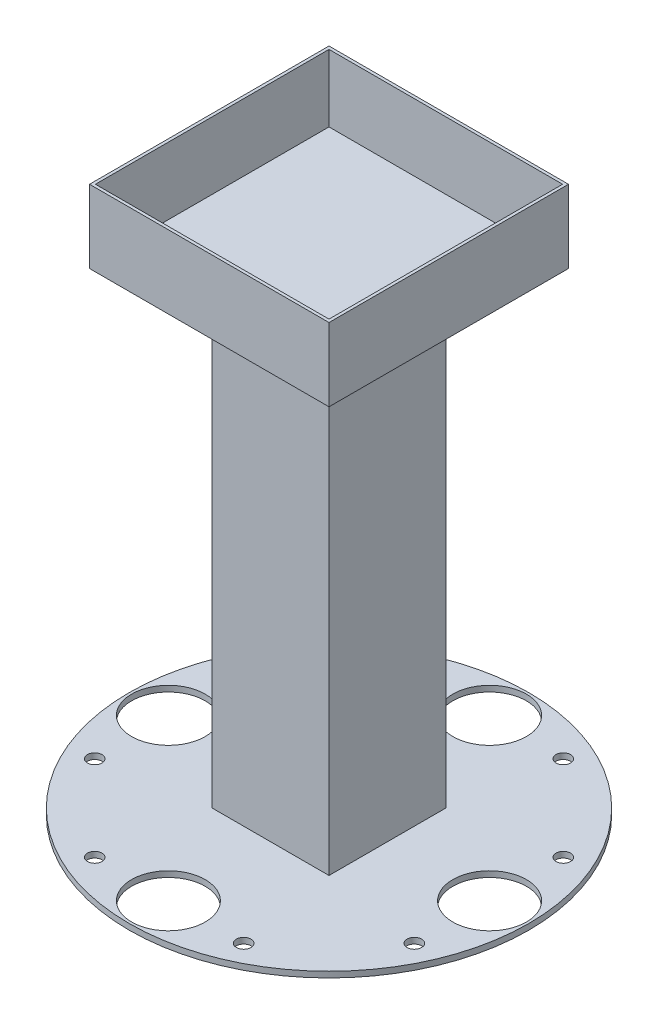
ISO-10303-21;
HEADER;
FILE_DESCRIPTION(('STEP AP214'),'2;1');
FILE_NAME('part.step','',(''),(''),'','','');
FILE_SCHEMA(('AUTOMOTIVE_DESIGN { 1 0 10303 214 1 1 1 1 }'));
ENDSEC;
DATA;
#1=APPLICATION_CONTEXT('core data for automotive mechanical design processes');
#2=APPLICATION_PROTOCOL_DEFINITION('international standard','automotive_design',2000,#1);
#3=PRODUCT_CONTEXT('',#1,'mechanical');
#4=PRODUCT('Part','Part','',(#3));
#5=PRODUCT_RELATED_PRODUCT_CATEGORY('part','',(#4));
#6=PRODUCT_DEFINITION_FORMATION('','',#4);
#7=PRODUCT_DEFINITION_CONTEXT('part definition',#1,'design');
#8=PRODUCT_DEFINITION('design','',#6,#7);
#9=PRODUCT_DEFINITION_SHAPE('','',#8);
#10=(LENGTH_UNIT() NAMED_UNIT(*) SI_UNIT(.MILLI.,.METRE.));
#11=(NAMED_UNIT(*) PLANE_ANGLE_UNIT() SI_UNIT($,.RADIAN.));
#12=(NAMED_UNIT(*) SI_UNIT($,.STERADIAN.) SOLID_ANGLE_UNIT());
#13=UNCERTAINTY_MEASURE_WITH_UNIT(LENGTH_MEASURE(1.E-05),#10,'distance_accuracy_value','');
#14=(GEOMETRIC_REPRESENTATION_CONTEXT(3) GLOBAL_UNCERTAINTY_ASSIGNED_CONTEXT((#13)) GLOBAL_UNIT_ASSIGNED_CONTEXT((#10,
#11,#12)) REPRESENTATION_CONTEXT('',''));
#15=CARTESIAN_POINT('',(0.,0.,0.));
#16=DIRECTION('',(0.,0.,1.));
#17=DIRECTION('',(1.,0.,0.));
#18=AXIS2_PLACEMENT_3D('',#15,#16,#17);
#19=CARTESIAN_POINT('',(0.,2.54,0.));
#20=DIRECTION('',(0.,1.,0.));
#21=DIRECTION('',(0.,0.,1.));
#22=AXIS2_PLACEMENT_3D('',#19,#20,#21);
#23=PLANE('',#22);
#24=CARTESIAN_POINT('',(-2.43879971518193E-13,2.54,-69.85));
#25=DIRECTION('',(0.,1.,0.));
#26=DIRECTION('',(1.,0.,0.));
#27=AXIS2_PLACEMENT_3D('',#24,#25,#26);
#28=CIRCLE('',#27,16.002);
#29=CARTESIAN_POINT('',(16.0019999999998,2.54,-69.8500000000001));
#30=VERTEX_POINT('',#29);
#31=EDGE_CURVE('E466',#30,#30,#28,.T.);
#32=ORIENTED_EDGE('',*,*,#31,.F.);
#33=EDGE_LOOP('',(#32));
#34=FACE_BOUND('',#33,.T.);
#35=CARTESIAN_POINT('',(-69.85,2.54,0.));
#36=DIRECTION('',(0.,1.,0.));
#37=DIRECTION('',(0.,0.,-1.));
#38=AXIS2_PLACEMENT_3D('',#35,#36,#37);
#39=CIRCLE('',#38,16.002);
#40=CARTESIAN_POINT('',(-69.85,2.54,-16.002));
#41=VERTEX_POINT('',#40);
#42=EDGE_CURVE('E474',#41,#41,#39,.T.);
#43=ORIENTED_EDGE('',*,*,#42,.F.);
#44=EDGE_LOOP('',(#43));
#45=FACE_BOUND('',#44,.T.);
#46=CARTESIAN_POINT('',(7.31639914554579E-13,2.54,69.85));
#47=DIRECTION('',(0.,1.,0.));
#48=DIRECTION('',(-1.,0.,0.));
#49=AXIS2_PLACEMENT_3D('',#46,#47,#48);
#50=CIRCLE('',#49,16.002);
#51=CARTESIAN_POINT('',(-16.0019999999993,2.54,69.8500000000002));
#52=VERTEX_POINT('',#51);
#53=EDGE_CURVE('E484',#52,#52,#50,.T.);
#54=ORIENTED_EDGE('',*,*,#53,.F.);
#55=EDGE_LOOP('',(#54));
#56=FACE_BOUND('',#55,.T.);
#57=CARTESIAN_POINT('',(69.85,2.54,0.));
#58=DIRECTION('',(0.,1.,0.));
#59=DIRECTION('',(0.,0.,1.));
#60=AXIS2_PLACEMENT_3D('',#57,#58,#59);
#61=CIRCLE('',#60,16.002);
#62=CARTESIAN_POINT('',(69.85,2.54,16.002));
#63=VERTEX_POINT('',#62);
#64=EDGE_CURVE('E166',#63,#63,#61,.T.);
#65=ORIENTED_EDGE('',*,*,#64,.F.);
#66=EDGE_LOOP('',(#65));
#67=FACE_BOUND('',#66,.T.);
#68=CARTESIAN_POINT('',(32.385,2.54,-69.50075));
#69=DIRECTION('',(0.,-1.,0.));
#70=DIRECTION('',(0.,0.,-1.));
#71=AXIS2_PLACEMENT_3D('',#68,#69,#70);
#72=CIRCLE('',#71,3.17499999999999);
#73=CARTESIAN_POINT('',(32.385,2.54,-72.67575));
#74=VERTEX_POINT('',#73);
#75=EDGE_CURVE('E254',#74,#74,#72,.T.);
#76=ORIENTED_EDGE('',*,*,#75,.T.);
#77=EDGE_LOOP('',(#76));
#78=FACE_BOUND('',#77,.T.);
#79=CARTESIAN_POINT('',(-32.385,2.54,-69.50075));
#80=DIRECTION('',(0.,1.,0.));
#81=DIRECTION('',(0.,0.,1.));
#82=AXIS2_PLACEMENT_3D('',#79,#80,#81);
#83=CIRCLE('',#82,3.17499999999999);
#84=CARTESIAN_POINT('',(-32.385,2.54,-66.32575));
#85=VERTEX_POINT('',#84);
#86=EDGE_CURVE('E237',#85,#85,#83,.T.);
#87=ORIENTED_EDGE('',*,*,#86,.F.);
#88=EDGE_LOOP('',(#87));
#89=FACE_BOUND('',#88,.T.);
#90=CARTESIAN_POINT('',(-32.385,2.54,69.50075));
#91=DIRECTION('',(0.,-1.,0.));
#92=DIRECTION('',(0.,0.,-1.));
#93=AXIS2_PLACEMENT_3D('',#90,#91,#92);
#94=CIRCLE('',#93,3.175);
#95=CARTESIAN_POINT('',(-32.385,2.54,66.32575));
#96=VERTEX_POINT('',#95);
#97=EDGE_CURVE('E232',#96,#96,#94,.T.);
#98=ORIENTED_EDGE('',*,*,#97,.T.);
#99=EDGE_LOOP('',(#98));
#100=FACE_BOUND('',#99,.T.);
#101=CARTESIAN_POINT('',(32.385,2.54,69.50075));
#102=DIRECTION('',(0.,1.,0.));
#103=DIRECTION('',(0.,0.,1.));
#104=AXIS2_PLACEMENT_3D('',#101,#102,#103);
#105=CIRCLE('',#104,3.175);
#106=CARTESIAN_POINT('',(32.385,2.54,72.67575));
#107=VERTEX_POINT('',#106);
#108=EDGE_CURVE('E249',#107,#107,#105,.T.);
#109=ORIENTED_EDGE('',*,*,#108,.F.);
#110=EDGE_LOOP('',(#109));
#111=FACE_BOUND('',#110,.T.);
#112=DIRECTION('',(0.,0.,-1.));
#113=VECTOR('',#112,1.);
#114=CARTESIAN_POINT('',(25.4,2.54,-25.4));
#115=LINE('',#114,#113);
#116=CARTESIAN_POINT('',(25.4,2.54,25.4));
#117=VERTEX_POINT('',#116);
#118=CARTESIAN_POINT('',(25.4,2.54,-25.4));
#119=VERTEX_POINT('',#118);
#120=EDGE_CURVE('E70',#117,#119,#115,.T.);
#121=ORIENTED_EDGE('',*,*,#120,.F.);
#122=DIRECTION('',(1.,0.,0.));
#123=VECTOR('',#122,1.);
#124=CARTESIAN_POINT('',(-25.4,2.54,25.4));
#125=LINE('',#124,#123);
#126=CARTESIAN_POINT('',(-25.4,2.54,25.4));
#127=VERTEX_POINT('',#126);
#128=EDGE_CURVE('E270',#127,#117,#125,.T.);
#129=ORIENTED_EDGE('',*,*,#128,.F.);
#130=DIRECTION('',(0.,0.,1.));
#131=VECTOR('',#130,1.);
#132=CARTESIAN_POINT('',(-25.4,2.54,-25.4));
#133=LINE('',#132,#131);
#134=CARTESIAN_POINT('',(-25.4,2.54,-25.4));
#135=VERTEX_POINT('',#134);
#136=EDGE_CURVE('E289',#135,#127,#133,.T.);
#137=ORIENTED_EDGE('',*,*,#136,.F.);
#138=DIRECTION('',(-1.,0.,0.));
#139=VECTOR('',#138,1.);
#140=CARTESIAN_POINT('',(-25.4,2.54,-25.4));
#141=LINE('',#140,#139);
#142=EDGE_CURVE('E285',#119,#135,#141,.T.);
#143=ORIENTED_EDGE('',*,*,#142,.F.);
#144=EDGE_LOOP('',(#121,#129,#137,#143));
#145=FACE_BOUND('',#144,.T.);
#146=CARTESIAN_POINT('',(0.,2.54,0.));
#147=DIRECTION('',(0.,1.,0.));
#148=DIRECTION('',(0.,0.,1.));
#149=AXIS2_PLACEMENT_3D('',#146,#147,#148);
#150=CIRCLE('',#149,86.9315);
#151=CARTESIAN_POINT('',(0.,2.54,86.9315));
#152=VERTEX_POINT('',#151);
#153=EDGE_CURVE('E11',#152,#152,#150,.T.);
#154=ORIENTED_EDGE('',*,*,#153,.T.);
#155=EDGE_LOOP('',(#154));
#156=FACE_BOUND('',#155,.T.);
#157=CARTESIAN_POINT('',(-69.50075,2.54,32.385));
#158=DIRECTION('',(0.,1.,0.));
#159=DIRECTION('',(0.,0.,1.));
#160=AXIS2_PLACEMENT_3D('',#157,#158,#159);
#161=CIRCLE('',#160,3.175);
#162=CARTESIAN_POINT('',(-69.50075,2.54,35.56));
#163=VERTEX_POINT('',#162);
#164=EDGE_CURVE('E238',#163,#163,#161,.T.);
#165=ORIENTED_EDGE('',*,*,#164,.F.);
#166=EDGE_LOOP('',(#165));
#167=FACE_BOUND('',#166,.T.);
#168=CARTESIAN_POINT('',(-69.50075,2.54,-32.385));
#169=DIRECTION('',(0.,-1.,0.));
#170=DIRECTION('',(0.,0.,-1.));
#171=AXIS2_PLACEMENT_3D('',#168,#169,#170);
#172=CIRCLE('',#171,3.175);
#173=CARTESIAN_POINT('',(-69.50075,2.54,-35.56));
#174=VERTEX_POINT('',#173);
#175=EDGE_CURVE('E233',#174,#174,#172,.T.);
#176=ORIENTED_EDGE('',*,*,#175,.T.);
#177=EDGE_LOOP('',(#176));
#178=FACE_BOUND('',#177,.T.);
#179=CARTESIAN_POINT('',(69.50075,2.54,-32.385));
#180=DIRECTION('',(0.,1.,0.));
#181=DIRECTION('',(0.,0.,1.));
#182=AXIS2_PLACEMENT_3D('',#179,#180,#181);
#183=CIRCLE('',#182,3.175);
#184=CARTESIAN_POINT('',(69.50075,2.54,-29.21));
#185=VERTEX_POINT('',#184);
#186=EDGE_CURVE('E250',#185,#185,#183,.T.);
#187=ORIENTED_EDGE('',*,*,#186,.F.);
#188=EDGE_LOOP('',(#187));
#189=FACE_BOUND('',#188,.T.);
#190=CARTESIAN_POINT('',(69.50075,2.54,32.385));
#191=DIRECTION('',(0.,-1.,0.));
#192=DIRECTION('',(0.,0.,-1.));
#193=AXIS2_PLACEMENT_3D('',#190,#191,#192);
#194=CIRCLE('',#193,3.175);
#195=CARTESIAN_POINT('',(69.50075,2.54,29.21));
#196=VERTEX_POINT('',#195);
#197=EDGE_CURVE('E245',#196,#196,#194,.T.);
#198=ORIENTED_EDGE('',*,*,#197,.T.);
#199=EDGE_LOOP('',(#198));
#200=FACE_BOUND('',#199,.T.);
#201=ADVANCED_FACE('F44',(#34,#45,#56,#67,#78,#89,#100,#111,#145,#156,#167,#178,#189,#200),#23,.T.);
#202=CARTESIAN_POINT('',(0.,0.,0.));
#203=DIRECTION('',(0.,1.,0.));
#204=DIRECTION('',(0.,0.,1.));
#205=AXIS2_PLACEMENT_3D('',#202,#203,#204);
#206=PLANE('',#205);
#207=CARTESIAN_POINT('',(-2.43879971518193E-13,0.,-69.85));
#208=DIRECTION('',(0.,1.,0.));
#209=DIRECTION('',(1.,0.,0.));
#210=AXIS2_PLACEMENT_3D('',#207,#208,#209);
#211=CIRCLE('',#210,16.002);
#212=CARTESIAN_POINT('',(16.0019999999998,0.,-69.8500000000001));
#213=VERTEX_POINT('',#212);
#214=EDGE_CURVE('E463',#213,#213,#211,.T.);
#215=ORIENTED_EDGE('',*,*,#214,.T.);
#216=EDGE_LOOP('',(#215));
#217=FACE_BOUND('',#216,.T.);
#218=CARTESIAN_POINT('',(-69.85,0.,0.));
#219=DIRECTION('',(0.,1.,0.));
#220=DIRECTION('',(0.,0.,-1.));
#221=AXIS2_PLACEMENT_3D('',#218,#219,#220);
#222=CIRCLE('',#221,16.002);
#223=CARTESIAN_POINT('',(-69.85,0.,-16.002));
#224=VERTEX_POINT('',#223);
#225=EDGE_CURVE('E468',#224,#224,#222,.T.);
#226=ORIENTED_EDGE('',*,*,#225,.T.);
#227=EDGE_LOOP('',(#226));
#228=FACE_BOUND('',#227,.T.);
#229=CARTESIAN_POINT('',(7.31639914554579E-13,0.,69.85));
#230=DIRECTION('',(0.,1.,0.));
#231=DIRECTION('',(-1.,0.,0.));
#232=AXIS2_PLACEMENT_3D('',#229,#230,#231);
#233=CIRCLE('',#232,16.002);
#234=CARTESIAN_POINT('',(-16.0019999999993,0.,69.8500000000002));
#235=VERTEX_POINT('',#234);
#236=EDGE_CURVE('E480',#235,#235,#233,.T.);
#237=ORIENTED_EDGE('',*,*,#236,.T.);
#238=EDGE_LOOP('',(#237));
#239=FACE_BOUND('',#238,.T.);
#240=CARTESIAN_POINT('',(69.85,0.,0.));
#241=DIRECTION('',(0.,1.,0.));
#242=DIRECTION('',(0.,0.,1.));
#243=AXIS2_PLACEMENT_3D('',#240,#241,#242);
#244=CIRCLE('',#243,16.002);
#245=CARTESIAN_POINT('',(69.85,0.,16.002));
#246=VERTEX_POINT('',#245);
#247=EDGE_CURVE('E176',#246,#246,#244,.T.);
#248=ORIENTED_EDGE('',*,*,#247,.T.);
#249=EDGE_LOOP('',(#248));
#250=FACE_BOUND('',#249,.T.);
#251=CARTESIAN_POINT('',(69.50075,0.,-32.385));
#252=DIRECTION('',(0.,1.,0.));
#253=DIRECTION('',(0.,0.,1.));
#254=AXIS2_PLACEMENT_3D('',#251,#252,#253);
#255=CIRCLE('',#254,3.175);
#256=CARTESIAN_POINT('',(69.50075,0.,-29.21));
#257=VERTEX_POINT('',#256);
#258=EDGE_CURVE('E335',#257,#257,#255,.T.);
#259=ORIENTED_EDGE('',*,*,#258,.T.);
#260=EDGE_LOOP('',(#259));
#261=FACE_BOUND('',#260,.T.);
#262=CARTESIAN_POINT('',(-32.385,0.,-69.50075));
#263=DIRECTION('',(0.,1.,0.));
#264=DIRECTION('',(0.,0.,1.));
#265=AXIS2_PLACEMENT_3D('',#262,#263,#264);
#266=CIRCLE('',#265,3.17499999999999);
#267=CARTESIAN_POINT('',(-32.385,0.,-66.32575));
#268=VERTEX_POINT('',#267);
#269=EDGE_CURVE('E328',#268,#268,#266,.T.);
#270=ORIENTED_EDGE('',*,*,#269,.T.);
#271=EDGE_LOOP('',(#270));
#272=FACE_BOUND('',#271,.T.);
#273=CARTESIAN_POINT('',(-69.50075,0.,32.385));
#274=DIRECTION('',(0.,1.,0.));
#275=DIRECTION('',(0.,0.,1.));
#276=AXIS2_PLACEMENT_3D('',#273,#274,#275);
#277=CIRCLE('',#276,3.175);
#278=CARTESIAN_POINT('',(-69.50075,0.,35.56));
#279=VERTEX_POINT('',#278);
#280=EDGE_CURVE('E320',#279,#279,#277,.T.);
#281=ORIENTED_EDGE('',*,*,#280,.T.);
#282=EDGE_LOOP('',(#281));
#283=FACE_BOUND('',#282,.T.);
#284=CARTESIAN_POINT('',(32.385,0.,69.50075));
#285=DIRECTION('',(0.,1.,0.));
#286=DIRECTION('',(0.,0.,1.));
#287=AXIS2_PLACEMENT_3D('',#284,#285,#286);
#288=CIRCLE('',#287,3.175);
#289=CARTESIAN_POINT('',(32.385,0.,72.67575));
#290=VERTEX_POINT('',#289);
#291=EDGE_CURVE('E264',#290,#290,#288,.T.);
#292=ORIENTED_EDGE('',*,*,#291,.T.);
#293=EDGE_LOOP('',(#292));
#294=FACE_BOUND('',#293,.T.);
#295=CARTESIAN_POINT('',(0.,0.,0.));
#296=DIRECTION('',(0.,1.,0.));
#297=DIRECTION('',(0.,0.,1.));
#298=AXIS2_PLACEMENT_3D('',#295,#296,#297);
#299=CIRCLE('',#298,86.9315);
#300=CARTESIAN_POINT('',(0.,0.,86.9315));
#301=VERTEX_POINT('',#300);
#302=EDGE_CURVE('E54',#301,#301,#299,.T.);
#303=ORIENTED_EDGE('',*,*,#302,.F.);
#304=EDGE_LOOP('',(#303));
#305=FACE_BOUND('',#304,.T.);
#306=CARTESIAN_POINT('',(-32.385,0.,69.50075));
#307=DIRECTION('',(0.,1.,0.));
#308=DIRECTION('',(0.,0.,1.));
#309=AXIS2_PLACEMENT_3D('',#306,#307,#308);
#310=CIRCLE('',#309,3.175);
#311=CARTESIAN_POINT('',(-32.385,0.,72.67575));
#312=VERTEX_POINT('',#311);
#313=EDGE_CURVE('E316',#312,#312,#310,.F.);
#314=ORIENTED_EDGE('',*,*,#313,.F.);
#315=EDGE_LOOP('',(#314));
#316=FACE_BOUND('',#315,.T.);
#317=CARTESIAN_POINT('',(-69.50075,0.,-32.385));
#318=DIRECTION('',(0.,1.,0.));
#319=DIRECTION('',(0.,0.,1.));
#320=AXIS2_PLACEMENT_3D('',#317,#318,#319);
#321=CIRCLE('',#320,3.175);
#322=CARTESIAN_POINT('',(-69.50075,0.,-29.21));
#323=VERTEX_POINT('',#322);
#324=EDGE_CURVE('E324',#323,#323,#321,.F.);
#325=ORIENTED_EDGE('',*,*,#324,.F.);
#326=EDGE_LOOP('',(#325));
#327=FACE_BOUND('',#326,.T.);
#328=CARTESIAN_POINT('',(32.385,0.,-69.50075));
#329=DIRECTION('',(0.,1.,0.));
#330=DIRECTION('',(0.,0.,1.));
#331=AXIS2_PLACEMENT_3D('',#328,#329,#330);
#332=CIRCLE('',#331,3.17499999999999);
#333=CARTESIAN_POINT('',(32.385,0.,-66.32575));
#334=VERTEX_POINT('',#333);
#335=EDGE_CURVE('E332',#334,#334,#332,.F.);
#336=ORIENTED_EDGE('',*,*,#335,.F.);
#337=EDGE_LOOP('',(#336));
#338=FACE_BOUND('',#337,.T.);
#339=CARTESIAN_POINT('',(69.50075,0.,32.385));
#340=DIRECTION('',(0.,1.,0.));
#341=DIRECTION('',(0.,0.,1.));
#342=AXIS2_PLACEMENT_3D('',#339,#340,#341);
#343=CIRCLE('',#342,3.175);
#344=CARTESIAN_POINT('',(69.50075,0.,35.56));
#345=VERTEX_POINT('',#344);
#346=EDGE_CURVE('E48',#345,#345,#343,.F.);
#347=ORIENTED_EDGE('',*,*,#346,.F.);
#348=EDGE_LOOP('',(#347));
#349=FACE_BOUND('',#348,.T.);
#350=ADVANCED_FACE('F346',(#217,#228,#239,#250,#261,#272,#283,#294,#305,#316,#327,#338,#349),
#206,.F.);
#351=CARTESIAN_POINT('',(0.,2.54,0.));
#352=DIRECTION('',(0.,-1.,0.));
#353=DIRECTION('',(0.,0.,-1.));
#354=AXIS2_PLACEMENT_3D('',#351,#352,#353);
#355=CYLINDRICAL_SURFACE('',#354,86.9315);
#356=ORIENTED_EDGE('',*,*,#153,.F.);
#357=EDGE_LOOP('',(#356));
#358=FACE_BOUND('',#357,.T.);
#359=ORIENTED_EDGE('',*,*,#302,.T.);
#360=EDGE_LOOP('',(#359));
#361=FACE_BOUND('',#360,.T.);
#362=ADVANCED_FACE('F46',(#358,#361),#355,.T.);
#363=CARTESIAN_POINT('',(25.4,205.74,-25.4));
#364=DIRECTION('',(-1.,0.,0.));
#365=DIRECTION('',(0.,0.,1.));
#366=AXIS2_PLACEMENT_3D('',#363,#364,#365);
#367=PLANE('',#366);
#368=ORIENTED_EDGE('',*,*,#120,.T.);
#369=DIRECTION('',(0.,-1.,0.));
#370=VECTOR('',#369,1.);
#371=CARTESIAN_POINT('',(25.4,205.74,-25.4));
#372=LINE('',#371,#370);
#373=CARTESIAN_POINT('',(25.4,205.74,-25.4));
#374=VERTEX_POINT('',#373);
#375=EDGE_CURVE('E306',#374,#119,#372,.T.);
#376=ORIENTED_EDGE('',*,*,#375,.F.);
#377=DIRECTION('',(0.,0.,-1.));
#378=VECTOR('',#377,1.);
#379=CARTESIAN_POINT('',(25.4,205.74,-25.4));
#380=LINE('',#379,#378);
#381=CARTESIAN_POINT('',(25.4,205.74,25.4));
#382=VERTEX_POINT('',#381);
#383=EDGE_CURVE('E265',#382,#374,#380,.T.);
#384=ORIENTED_EDGE('',*,*,#383,.F.);
#385=DIRECTION('',(0.,-1.,0.));
#386=VECTOR('',#385,1.);
#387=CARTESIAN_POINT('',(25.4,205.74,25.4));
#388=LINE('',#387,#386);
#389=EDGE_CURVE('E282',#382,#117,#388,.T.);
#390=ORIENTED_EDGE('',*,*,#389,.T.);
#391=EDGE_LOOP('',(#368,#376,#384,#390));
#392=FACE_BOUND('',#391,.T.);
#393=ADVANCED_FACE('F354',(#392),#367,.F.);
#394=CARTESIAN_POINT('',(-25.4,205.74,-25.4));
#395=DIRECTION('',(0.,0.,1.));
#396=DIRECTION('',(1.,0.,0.));
#397=AXIS2_PLACEMENT_3D('',#394,#395,#396);
#398=PLANE('',#397);
#399=ORIENTED_EDGE('',*,*,#142,.T.);
#400=DIRECTION('',(0.,-1.,0.));
#401=VECTOR('',#400,1.);
#402=CARTESIAN_POINT('',(-25.4,205.74,-25.4));
#403=LINE('',#402,#401);
#404=CARTESIAN_POINT('',(-25.4,205.74,-25.4));
#405=VERTEX_POINT('',#404);
#406=EDGE_CURVE('E302',#405,#135,#403,.T.);
#407=ORIENTED_EDGE('',*,*,#406,.F.);
#408=DIRECTION('',(-1.,0.,0.));
#409=VECTOR('',#408,1.);
#410=CARTESIAN_POINT('',(-25.4,205.74,-25.4));
#411=LINE('',#410,#409);
#412=EDGE_CURVE('E269',#374,#405,#411,.T.);
#413=ORIENTED_EDGE('',*,*,#412,.F.);
#414=ORIENTED_EDGE('',*,*,#375,.T.);
#415=EDGE_LOOP('',(#399,#407,#413,#414));
#416=FACE_BOUND('',#415,.T.);
#417=ADVANCED_FACE('F363',(#416),#398,.F.);
#418=CARTESIAN_POINT('',(-25.4,205.74,-25.4));
#419=DIRECTION('',(1.,0.,0.));
#420=DIRECTION('',(0.,0.,-1.));
#421=AXIS2_PLACEMENT_3D('',#418,#419,#420);
#422=PLANE('',#421);
#423=ORIENTED_EDGE('',*,*,#136,.T.);
#424=DIRECTION('',(0.,-1.,0.));
#425=VECTOR('',#424,1.);
#426=CARTESIAN_POINT('',(-25.4,205.74,25.4));
#427=LINE('',#426,#425);
#428=CARTESIAN_POINT('',(-25.4,205.74,25.4));
#429=VERTEX_POINT('',#428);
#430=EDGE_CURVE('E298',#429,#127,#427,.T.);
#431=ORIENTED_EDGE('',*,*,#430,.F.);
#432=DIRECTION('',(0.,0.,1.));
#433=VECTOR('',#432,1.);
#434=CARTESIAN_POINT('',(-25.4,205.74,-25.4));
#435=LINE('',#434,#433);
#436=EDGE_CURVE('E274',#405,#429,#435,.T.);
#437=ORIENTED_EDGE('',*,*,#436,.F.);
#438=ORIENTED_EDGE('',*,*,#406,.T.);
#439=EDGE_LOOP('',(#423,#431,#437,#438));
#440=FACE_BOUND('',#439,.T.);
#441=ADVANCED_FACE('F367',(#440),#422,.F.);
#442=CARTESIAN_POINT('',(-25.4,205.74,25.4));
#443=DIRECTION('',(0.,0.,-1.));
#444=DIRECTION('',(-1.,0.,0.));
#445=AXIS2_PLACEMENT_3D('',#442,#443,#444);
#446=PLANE('',#445);
#447=ORIENTED_EDGE('',*,*,#128,.T.);
#448=ORIENTED_EDGE('',*,*,#389,.F.);
#449=DIRECTION('',(1.,0.,0.));
#450=VECTOR('',#449,1.);
#451=CARTESIAN_POINT('',(-25.4,205.74,25.4));
#452=LINE('',#451,#450);
#453=EDGE_CURVE('E278',#429,#382,#452,.T.);
#454=ORIENTED_EDGE('',*,*,#453,.F.);
#455=ORIENTED_EDGE('',*,*,#430,.T.);
#456=EDGE_LOOP('',(#447,#448,#454,#455));
#457=FACE_BOUND('',#456,.T.);
#458=ADVANCED_FACE('F371',(#457),#446,.F.);
#459=CARTESIAN_POINT('',(32.385,-200.66,69.50075));
#460=DIRECTION('',(0.,1.,0.));
#461=DIRECTION('',(0.,0.,1.));
#462=AXIS2_PLACEMENT_3D('',#459,#460,#461);
#463=CYLINDRICAL_SURFACE('',#462,3.175);
#464=ORIENTED_EDGE('',*,*,#108,.T.);
#465=EDGE_LOOP('',(#464));
#466=FACE_BOUND('',#465,.T.);
#467=ORIENTED_EDGE('',*,*,#291,.F.);
#468=EDGE_LOOP('',(#467));
#469=FACE_BOUND('',#468,.T.);
#470=ADVANCED_FACE('F375',(#466,#469),#463,.F.);
#471=CARTESIAN_POINT('',(-32.385,-200.66,69.50075));
#472=DIRECTION('',(0.,1.,0.));
#473=DIRECTION('',(0.,0.,1.));
#474=AXIS2_PLACEMENT_3D('',#471,#472,#473);
#475=CYLINDRICAL_SURFACE('',#474,3.175);
#476=ORIENTED_EDGE('',*,*,#97,.F.);
#477=EDGE_LOOP('',(#476));
#478=FACE_BOUND('',#477,.T.);
#479=ORIENTED_EDGE('',*,*,#313,.T.);
#480=EDGE_LOOP('',(#479));
#481=FACE_BOUND('',#480,.T.);
#482=ADVANCED_FACE('F379',(#478,#481),#475,.F.);
#483=CARTESIAN_POINT('',(-69.50075,-200.66,32.385));
#484=DIRECTION('',(0.,1.,0.));
#485=DIRECTION('',(0.,0.,1.));
#486=AXIS2_PLACEMENT_3D('',#483,#484,#485);
#487=CYLINDRICAL_SURFACE('',#486,3.175);
#488=ORIENTED_EDGE('',*,*,#164,.T.);
#489=EDGE_LOOP('',(#488));
#490=FACE_BOUND('',#489,.T.);
#491=ORIENTED_EDGE('',*,*,#280,.F.);
#492=EDGE_LOOP('',(#491));
#493=FACE_BOUND('',#492,.T.);
#494=ADVANCED_FACE('F400',(#490,#493),#487,.F.);
#495=CARTESIAN_POINT('',(-69.50075,-200.66,-32.385));
#496=DIRECTION('',(0.,1.,0.));
#497=DIRECTION('',(0.,0.,1.));
#498=AXIS2_PLACEMENT_3D('',#495,#496,#497);
#499=CYLINDRICAL_SURFACE('',#498,3.175);
#500=ORIENTED_EDGE('',*,*,#175,.F.);
#501=EDGE_LOOP('',(#500));
#502=FACE_BOUND('',#501,.T.);
#503=ORIENTED_EDGE('',*,*,#324,.T.);
#504=EDGE_LOOP('',(#503));
#505=FACE_BOUND('',#504,.T.);
#506=ADVANCED_FACE('F385',(#502,#505),#499,.F.);
#507=CARTESIAN_POINT('',(-32.385,-200.66,-69.50075));
#508=DIRECTION('',(0.,1.,0.));
#509=DIRECTION('',(0.,0.,1.));
#510=AXIS2_PLACEMENT_3D('',#507,#508,#509);
#511=CYLINDRICAL_SURFACE('',#510,3.17499999999999);
#512=ORIENTED_EDGE('',*,*,#86,.T.);
#513=EDGE_LOOP('',(#512));
#514=FACE_BOUND('',#513,.T.);
#515=ORIENTED_EDGE('',*,*,#269,.F.);
#516=EDGE_LOOP('',(#515));
#517=FACE_BOUND('',#516,.T.);
#518=ADVANCED_FACE('F381',(#514,#517),#511,.F.);
#519=CARTESIAN_POINT('',(32.385,-200.66,-69.50075));
#520=DIRECTION('',(0.,1.,0.));
#521=DIRECTION('',(0.,0.,1.));
#522=AXIS2_PLACEMENT_3D('',#519,#520,#521);
#523=CYLINDRICAL_SURFACE('',#522,3.17499999999999);
#524=ORIENTED_EDGE('',*,*,#75,.F.);
#525=EDGE_LOOP('',(#524));
#526=FACE_BOUND('',#525,.T.);
#527=ORIENTED_EDGE('',*,*,#335,.T.);
#528=EDGE_LOOP('',(#527));
#529=FACE_BOUND('',#528,.T.);
#530=ADVANCED_FACE('F384',(#526,#529),#523,.F.);
#531=CARTESIAN_POINT('',(69.50075,-200.66,-32.385));
#532=DIRECTION('',(0.,1.,0.));
#533=DIRECTION('',(0.,0.,1.));
#534=AXIS2_PLACEMENT_3D('',#531,#532,#533);
#535=CYLINDRICAL_SURFACE('',#534,3.175);
#536=ORIENTED_EDGE('',*,*,#186,.T.);
#537=EDGE_LOOP('',(#536));
#538=FACE_BOUND('',#537,.T.);
#539=ORIENTED_EDGE('',*,*,#258,.F.);
#540=EDGE_LOOP('',(#539));
#541=FACE_BOUND('',#540,.T.);
#542=ADVANCED_FACE('F389',(#538,#541),#535,.F.);
#543=CARTESIAN_POINT('',(69.50075,-200.66,32.385));
#544=DIRECTION('',(0.,1.,0.));
#545=DIRECTION('',(0.,0.,1.));
#546=AXIS2_PLACEMENT_3D('',#543,#544,#545);
#547=CYLINDRICAL_SURFACE('',#546,3.175);
#548=ORIENTED_EDGE('',*,*,#197,.F.);
#549=EDGE_LOOP('',(#548));
#550=FACE_BOUND('',#549,.T.);
#551=ORIENTED_EDGE('',*,*,#346,.T.);
#552=EDGE_LOOP('',(#551));
#553=FACE_BOUND('',#552,.T.);
#554=ADVANCED_FACE('F344',(#550,#553),#547,.F.);
#555=CARTESIAN_POINT('',(0.,205.74,0.));
#556=DIRECTION('',(0.,1.,0.));
#557=DIRECTION('',(0.,0.,1.));
#558=AXIS2_PLACEMENT_3D('',#555,#556,#557);
#559=PLANE('',#558);
#560=DIRECTION('',(0.,0.,-1.));
#561=VECTOR('',#560,1.);
#562=CARTESIAN_POINT('',(52.07,205.74,-52.07));
#563=LINE('',#562,#561);
#564=CARTESIAN_POINT('',(52.07,205.74,52.07));
#565=VERTEX_POINT('',#564);
#566=CARTESIAN_POINT('',(52.07,205.74,-52.07));
#567=VERTEX_POINT('',#566);
#568=EDGE_CURVE('E185',#565,#567,#563,.T.);
#569=ORIENTED_EDGE('',*,*,#568,.F.);
#570=DIRECTION('',(1.,0.,0.));
#571=VECTOR('',#570,1.);
#572=CARTESIAN_POINT('',(-52.07,205.74,52.07));
#573=LINE('',#572,#571);
#574=CARTESIAN_POINT('',(-52.07,205.74,52.07));
#575=VERTEX_POINT('',#574);
#576=EDGE_CURVE('E196',#575,#565,#573,.T.);
#577=ORIENTED_EDGE('',*,*,#576,.F.);
#578=DIRECTION('',(0.,0.,1.));
#579=VECTOR('',#578,1.);
#580=CARTESIAN_POINT('',(-52.07,205.74,-52.07));
#581=LINE('',#580,#579);
#582=CARTESIAN_POINT('',(-52.07,205.74,-52.07));
#583=VERTEX_POINT('',#582);
#584=EDGE_CURVE('E212',#583,#575,#581,.T.);
#585=ORIENTED_EDGE('',*,*,#584,.F.);
#586=DIRECTION('',(-1.,0.,0.));
#587=VECTOR('',#586,1.);
#588=CARTESIAN_POINT('',(-52.07,205.74,-52.07));
#589=LINE('',#588,#587);
#590=EDGE_CURVE('E209',#567,#583,#589,.T.);
#591=ORIENTED_EDGE('',*,*,#590,.F.);
#592=EDGE_LOOP('',(#569,#577,#585,#591));
#593=FACE_BOUND('',#592,.T.);
#594=ORIENTED_EDGE('',*,*,#453,.T.);
#595=ORIENTED_EDGE('',*,*,#383,.T.);
#596=ORIENTED_EDGE('',*,*,#412,.T.);
#597=ORIENTED_EDGE('',*,*,#436,.T.);
#598=EDGE_LOOP('',(#594,#595,#596,#597));
#599=FACE_BOUND('',#598,.T.);
#600=ADVANCED_FACE('F396',(#593,#599),#559,.F.);
#601=CARTESIAN_POINT('',(52.07,237.49,-52.07));
#602=DIRECTION('',(-1.,0.,0.));
#603=DIRECTION('',(0.,0.,1.));
#604=AXIS2_PLACEMENT_3D('',#601,#602,#603);
#605=PLANE('',#604);
#606=ORIENTED_EDGE('',*,*,#568,.T.);
#607=DIRECTION('',(0.,-1.,0.));
#608=VECTOR('',#607,1.);
#609=CARTESIAN_POINT('',(52.07,237.49,-52.07));
#610=LINE('',#609,#608);
#611=CARTESIAN_POINT('',(52.07,237.49,-52.07));
#612=VERTEX_POINT('',#611);
#613=EDGE_CURVE('E228',#612,#567,#610,.T.);
#614=ORIENTED_EDGE('',*,*,#613,.F.);
#615=DIRECTION('',(0.,0.,-1.));
#616=VECTOR('',#615,1.);
#617=CARTESIAN_POINT('',(52.07,237.49,-52.07));
#618=LINE('',#617,#616);
#619=CARTESIAN_POINT('',(52.07,237.49,52.07));
#620=VERTEX_POINT('',#619);
#621=EDGE_CURVE('E191',#620,#612,#618,.T.);
#622=ORIENTED_EDGE('',*,*,#621,.F.);
#623=DIRECTION('',(0.,-1.,0.));
#624=VECTOR('',#623,1.);
#625=CARTESIAN_POINT('',(52.07,237.49,52.07));
#626=LINE('',#625,#624);
#627=EDGE_CURVE('E205',#620,#565,#626,.T.);
#628=ORIENTED_EDGE('',*,*,#627,.T.);
#629=EDGE_LOOP('',(#606,#614,#622,#628));
#630=FACE_BOUND('',#629,.T.);
#631=ADVANCED_FACE('F408',(#630),#605,.F.);
#632=CARTESIAN_POINT('',(-52.07,237.49,-52.07));
#633=DIRECTION('',(0.,0.,1.));
#634=DIRECTION('',(1.,0.,0.));
#635=AXIS2_PLACEMENT_3D('',#632,#633,#634);
#636=PLANE('',#635);
#637=ORIENTED_EDGE('',*,*,#590,.T.);
#638=DIRECTION('',(0.,-1.,0.));
#639=VECTOR('',#638,1.);
#640=CARTESIAN_POINT('',(-52.07,237.49,-52.07));
#641=LINE('',#640,#639);
#642=CARTESIAN_POINT('',(-52.07,237.49,-52.07));
#643=VERTEX_POINT('',#642);
#644=EDGE_CURVE('E224',#643,#583,#641,.T.);
#645=ORIENTED_EDGE('',*,*,#644,.F.);
#646=DIRECTION('',(-1.,0.,0.));
#647=VECTOR('',#646,1.);
#648=CARTESIAN_POINT('',(-52.07,237.49,-52.07));
#649=LINE('',#648,#647);
#650=EDGE_CURVE('E195',#612,#643,#649,.T.);
#651=ORIENTED_EDGE('',*,*,#650,.F.);
#652=ORIENTED_EDGE('',*,*,#613,.T.);
#653=EDGE_LOOP('',(#637,#645,#651,#652));
#654=FACE_BOUND('',#653,.T.);
#655=ADVANCED_FACE('F411',(#654),#636,.F.);
#656=CARTESIAN_POINT('',(-52.07,237.49,-52.07));
#657=DIRECTION('',(1.,0.,0.));
#658=DIRECTION('',(0.,0.,-1.));
#659=AXIS2_PLACEMENT_3D('',#656,#657,#658);
#660=PLANE('',#659);
#661=ORIENTED_EDGE('',*,*,#584,.T.);
#662=DIRECTION('',(0.,-1.,0.));
#663=VECTOR('',#662,1.);
#664=CARTESIAN_POINT('',(-52.07,237.49,52.07));
#665=LINE('',#664,#663);
#666=CARTESIAN_POINT('',(-52.07,237.49,52.07));
#667=VERTEX_POINT('',#666);
#668=EDGE_CURVE('E220',#667,#575,#665,.T.);
#669=ORIENTED_EDGE('',*,*,#668,.F.);
#670=DIRECTION('',(0.,0.,1.));
#671=VECTOR('',#670,1.);
#672=CARTESIAN_POINT('',(-52.07,237.49,-52.07));
#673=LINE('',#672,#671);
#674=EDGE_CURVE('E199',#643,#667,#673,.T.);
#675=ORIENTED_EDGE('',*,*,#674,.F.);
#676=ORIENTED_EDGE('',*,*,#644,.T.);
#677=EDGE_LOOP('',(#661,#669,#675,#676));
#678=FACE_BOUND('',#677,.T.);
#679=ADVANCED_FACE('F415',(#678),#660,.F.);
#680=CARTESIAN_POINT('',(-52.07,237.49,52.07));
#681=DIRECTION('',(0.,0.,-1.));
#682=DIRECTION('',(-1.,0.,0.));
#683=AXIS2_PLACEMENT_3D('',#680,#681,#682);
#684=PLANE('',#683);
#685=ORIENTED_EDGE('',*,*,#576,.T.);
#686=ORIENTED_EDGE('',*,*,#627,.F.);
#687=DIRECTION('',(1.,0.,0.));
#688=VECTOR('',#687,1.);
#689=CARTESIAN_POINT('',(-52.07,237.49,52.07));
#690=LINE('',#689,#688);
#691=EDGE_CURVE('E202',#667,#620,#690,.T.);
#692=ORIENTED_EDGE('',*,*,#691,.F.);
#693=ORIENTED_EDGE('',*,*,#668,.T.);
#694=EDGE_LOOP('',(#685,#686,#692,#693));
#695=FACE_BOUND('',#694,.T.);
#696=ADVANCED_FACE('F419',(#695),#684,.F.);
#697=CARTESIAN_POINT('',(0.,237.49,0.));
#698=DIRECTION('',(0.,1.,0.));
#699=DIRECTION('',(0.,0.,1.));
#700=AXIS2_PLACEMENT_3D('',#697,#698,#699);
#701=PLANE('',#700);
#702=DIRECTION('',(0.,0.,-1.));
#703=VECTOR('',#702,1.);
#704=CARTESIAN_POINT('',(50.8,237.49,-50.8));
#705=LINE('',#704,#703);
#706=CARTESIAN_POINT('',(50.8,237.49,50.8));
#707=VERTEX_POINT('',#706);
#708=CARTESIAN_POINT('',(50.8,237.49,-50.8));
#709=VERTEX_POINT('',#708);
#710=EDGE_CURVE('E62',#707,#709,#705,.T.);
#711=ORIENTED_EDGE('',*,*,#710,.F.);
#712=DIRECTION('',(1.,0.,0.));
#713=VECTOR('',#712,1.);
#714=CARTESIAN_POINT('',(-50.8,237.49,50.8));
#715=LINE('',#714,#713);
#716=CARTESIAN_POINT('',(-50.8,237.49,50.8));
#717=VERTEX_POINT('',#716);
#718=EDGE_CURVE('E159',#717,#707,#715,.T.);
#719=ORIENTED_EDGE('',*,*,#718,.F.);
#720=DIRECTION('',(0.,0.,1.));
#721=VECTOR('',#720,1.);
#722=CARTESIAN_POINT('',(-50.8,237.49,-50.8));
#723=LINE('',#722,#721);
#724=CARTESIAN_POINT('',(-50.8,237.49,-50.8));
#725=VERTEX_POINT('',#724);
#726=EDGE_CURVE('E163',#725,#717,#723,.T.);
#727=ORIENTED_EDGE('',*,*,#726,.F.);
#728=DIRECTION('',(-1.,0.,0.));
#729=VECTOR('',#728,1.);
#730=CARTESIAN_POINT('',(-50.8,237.49,-50.8));
#731=LINE('',#730,#729);
#732=EDGE_CURVE('E175',#709,#725,#731,.T.);
#733=ORIENTED_EDGE('',*,*,#732,.F.);
#734=EDGE_LOOP('',(#711,#719,#727,#733));
#735=FACE_BOUND('',#734,.T.);
#736=ORIENTED_EDGE('',*,*,#621,.T.);
#737=ORIENTED_EDGE('',*,*,#650,.T.);
#738=ORIENTED_EDGE('',*,*,#674,.T.);
#739=ORIENTED_EDGE('',*,*,#691,.T.);
#740=EDGE_LOOP('',(#736,#737,#738,#739));
#741=FACE_BOUND('',#740,.T.);
#742=ADVANCED_FACE('F423',(#735,#741),#701,.T.);
#743=CARTESIAN_POINT('',(50.8,208.28,-50.8));
#744=DIRECTION('',(1.,0.,0.));
#745=DIRECTION('',(0.,0.,-1.));
#746=AXIS2_PLACEMENT_3D('',#743,#744,#745);
#747=PLANE('',#746);
#748=ORIENTED_EDGE('',*,*,#710,.T.);
#749=DIRECTION('',(0.,1.,0.));
#750=VECTOR('',#749,1.);
#751=CARTESIAN_POINT('',(50.8,208.28,-50.8));
#752=LINE('',#751,#750);
#753=CARTESIAN_POINT('',(50.8,208.28,-50.8));
#754=VERTEX_POINT('',#753);
#755=EDGE_CURVE('E134',#754,#709,#752,.T.);
#756=ORIENTED_EDGE('',*,*,#755,.F.);
#757=DIRECTION('',(0.,0.,-1.));
#758=VECTOR('',#757,1.);
#759=CARTESIAN_POINT('',(50.8,208.28,-50.8));
#760=LINE('',#759,#758);
#761=CARTESIAN_POINT('',(50.8,208.28,50.8));
#762=VERTEX_POINT('',#761);
#763=EDGE_CURVE('E138',#762,#754,#760,.T.);
#764=ORIENTED_EDGE('',*,*,#763,.F.);
#765=DIRECTION('',(0.,1.,0.));
#766=VECTOR('',#765,1.);
#767=CARTESIAN_POINT('',(50.8,208.28,50.8));
#768=LINE('',#767,#766);
#769=EDGE_CURVE('E182',#762,#707,#768,.T.);
#770=ORIENTED_EDGE('',*,*,#769,.T.);
#771=EDGE_LOOP('',(#748,#756,#764,#770));
#772=FACE_BOUND('',#771,.T.);
#773=ADVANCED_FACE('F136',(#772),#747,.F.);
#774=CARTESIAN_POINT('',(-50.8,208.28,50.8));
#775=DIRECTION('',(0.,0.,1.));
#776=DIRECTION('',(1.,0.,0.));
#777=AXIS2_PLACEMENT_3D('',#774,#775,#776);
#778=PLANE('',#777);
#779=ORIENTED_EDGE('',*,*,#718,.T.);
#780=ORIENTED_EDGE('',*,*,#769,.F.);
#781=DIRECTION('',(1.,0.,0.));
#782=VECTOR('',#781,1.);
#783=CARTESIAN_POINT('',(-50.8,208.28,50.8));
#784=LINE('',#783,#782);
#785=CARTESIAN_POINT('',(-50.8,208.28,50.8));
#786=VERTEX_POINT('',#785);
#787=EDGE_CURVE('E145',#786,#762,#784,.T.);
#788=ORIENTED_EDGE('',*,*,#787,.F.);
#789=DIRECTION('',(0.,1.,0.));
#790=VECTOR('',#789,1.);
#791=CARTESIAN_POINT('',(-50.8,208.28,50.8));
#792=LINE('',#791,#790);
#793=EDGE_CURVE('E186',#786,#717,#792,.T.);
#794=ORIENTED_EDGE('',*,*,#793,.T.);
#795=EDGE_LOOP('',(#779,#780,#788,#794));
#796=FACE_BOUND('',#795,.T.);
#797=ADVANCED_FACE('F433',(#796),#778,.F.);
#798=CARTESIAN_POINT('',(-50.8,208.28,-50.8));
#799=DIRECTION('',(-1.,0.,0.));
#800=DIRECTION('',(0.,0.,1.));
#801=AXIS2_PLACEMENT_3D('',#798,#799,#800);
#802=PLANE('',#801);
#803=ORIENTED_EDGE('',*,*,#726,.T.);
#804=ORIENTED_EDGE('',*,*,#793,.F.);
#805=DIRECTION('',(0.,0.,1.));
#806=VECTOR('',#805,1.);
#807=CARTESIAN_POINT('',(-50.8,208.28,-50.8));
#808=LINE('',#807,#806);
#809=CARTESIAN_POINT('',(-50.8,208.28,-50.8));
#810=VERTEX_POINT('',#809);
#811=EDGE_CURVE('E154',#810,#786,#808,.T.);
#812=ORIENTED_EDGE('',*,*,#811,.F.);
#813=DIRECTION('',(0.,1.,0.));
#814=VECTOR('',#813,1.);
#815=CARTESIAN_POINT('',(-50.8,208.28,-50.8));
#816=LINE('',#815,#814);
#817=EDGE_CURVE('E144',#810,#725,#816,.T.);
#818=ORIENTED_EDGE('',*,*,#817,.T.);
#819=EDGE_LOOP('',(#803,#804,#812,#818));
#820=FACE_BOUND('',#819,.T.);
#821=ADVANCED_FACE('F436',(#820),#802,.F.);
#822=CARTESIAN_POINT('',(-50.8,208.28,-50.8));
#823=DIRECTION('',(0.,0.,-1.));
#824=DIRECTION('',(-1.,0.,0.));
#825=AXIS2_PLACEMENT_3D('',#822,#823,#824);
#826=PLANE('',#825);
#827=ORIENTED_EDGE('',*,*,#732,.T.);
#828=ORIENTED_EDGE('',*,*,#817,.F.);
#829=DIRECTION('',(-1.,0.,0.));
#830=VECTOR('',#829,1.);
#831=CARTESIAN_POINT('',(-50.8,208.28,-50.8));
#832=LINE('',#831,#830);
#833=EDGE_CURVE('E148',#754,#810,#832,.T.);
#834=ORIENTED_EDGE('',*,*,#833,.F.);
#835=ORIENTED_EDGE('',*,*,#755,.T.);
#836=EDGE_LOOP('',(#827,#828,#834,#835));
#837=FACE_BOUND('',#836,.T.);
#838=ADVANCED_FACE('F149',(#837),#826,.F.);
#839=CARTESIAN_POINT('',(0.,208.28,0.));
#840=DIRECTION('',(0.,1.,0.));
#841=DIRECTION('',(0.,0.,1.));
#842=AXIS2_PLACEMENT_3D('',#839,#840,#841);
#843=PLANE('',#842);
#844=ORIENTED_EDGE('',*,*,#763,.T.);
#845=ORIENTED_EDGE('',*,*,#833,.T.);
#846=ORIENTED_EDGE('',*,*,#811,.T.);
#847=ORIENTED_EDGE('',*,*,#787,.T.);
#848=EDGE_LOOP('',(#844,#845,#846,#847));
#849=FACE_BOUND('',#848,.T.);
#850=ADVANCED_FACE('F156',(#849),#843,.T.);
#851=CARTESIAN_POINT('',(69.85,0.,0.));
#852=DIRECTION('',(0.,1.,0.));
#853=DIRECTION('',(0.,0.,1.));
#854=AXIS2_PLACEMENT_3D('',#851,#852,#853);
#855=CYLINDRICAL_SURFACE('',#854,16.002);
#856=ORIENTED_EDGE('',*,*,#247,.F.);
#857=EDGE_LOOP('',(#856));
#858=FACE_BOUND('',#857,.T.);
#859=ORIENTED_EDGE('',*,*,#64,.T.);
#860=EDGE_LOOP('',(#859));
#861=FACE_BOUND('',#860,.T.);
#862=ADVANCED_FACE('F445',(#858,#861),#855,.F.);
#863=CARTESIAN_POINT('',(7.31639914554579E-13,0.,69.85));
#864=DIRECTION('',(0.,1.,0.));
#865=DIRECTION('',(0.,0.,1.));
#866=AXIS2_PLACEMENT_3D('',#863,#864,#865);
#867=CYLINDRICAL_SURFACE('',#866,16.002);
#868=ORIENTED_EDGE('',*,*,#236,.F.);
#869=EDGE_LOOP('',(#868));
#870=FACE_BOUND('',#869,.T.);
#871=ORIENTED_EDGE('',*,*,#53,.T.);
#872=EDGE_LOOP('',(#871));
#873=FACE_BOUND('',#872,.T.);
#874=ADVANCED_FACE('F448',(#870,#873),#867,.F.);
#875=CARTESIAN_POINT('',(-69.85,0.,0.));
#876=DIRECTION('',(0.,1.,0.));
#877=DIRECTION('',(0.,0.,1.));
#878=AXIS2_PLACEMENT_3D('',#875,#876,#877);
#879=CYLINDRICAL_SURFACE('',#878,16.002);
#880=ORIENTED_EDGE('',*,*,#225,.F.);
#881=EDGE_LOOP('',(#880));
#882=FACE_BOUND('',#881,.T.);
#883=ORIENTED_EDGE('',*,*,#42,.T.);
#884=EDGE_LOOP('',(#883));
#885=FACE_BOUND('',#884,.T.);
#886=ADVANCED_FACE('F451',(#882,#885),#879,.F.);
#887=CARTESIAN_POINT('',(-2.43879971518193E-13,0.,-69.85));
#888=DIRECTION('',(0.,1.,0.));
#889=DIRECTION('',(0.,0.,1.));
#890=AXIS2_PLACEMENT_3D('',#887,#888,#889);
#891=CYLINDRICAL_SURFACE('',#890,16.002);
#892=ORIENTED_EDGE('',*,*,#214,.F.);
#893=EDGE_LOOP('',(#892));
#894=FACE_BOUND('',#893,.T.);
#895=ORIENTED_EDGE('',*,*,#31,.T.);
#896=EDGE_LOOP('',(#895));
#897=FACE_BOUND('',#896,.T.);
#898=ADVANCED_FACE('F455',(#894,#897),#891,.F.);
#899=CLOSED_SHELL('',(#201,#350,#362,#393,#417,#441,#458,#470,#482,#494,#506,#518,#530,#542,
#554,#600,#631,#655,#679,#696,#742,#773,#797,#821,#838,#850,#862,#874,#886,#898));
#900=MANIFOLD_SOLID_BREP('B2',#899);
#901=ADVANCED_BREP_SHAPE_REPRESENTATION('',(#18,#900),#14);
#902=SHAPE_DEFINITION_REPRESENTATION(#9,#901);
ENDSEC;
END-ISO-10303-21;
